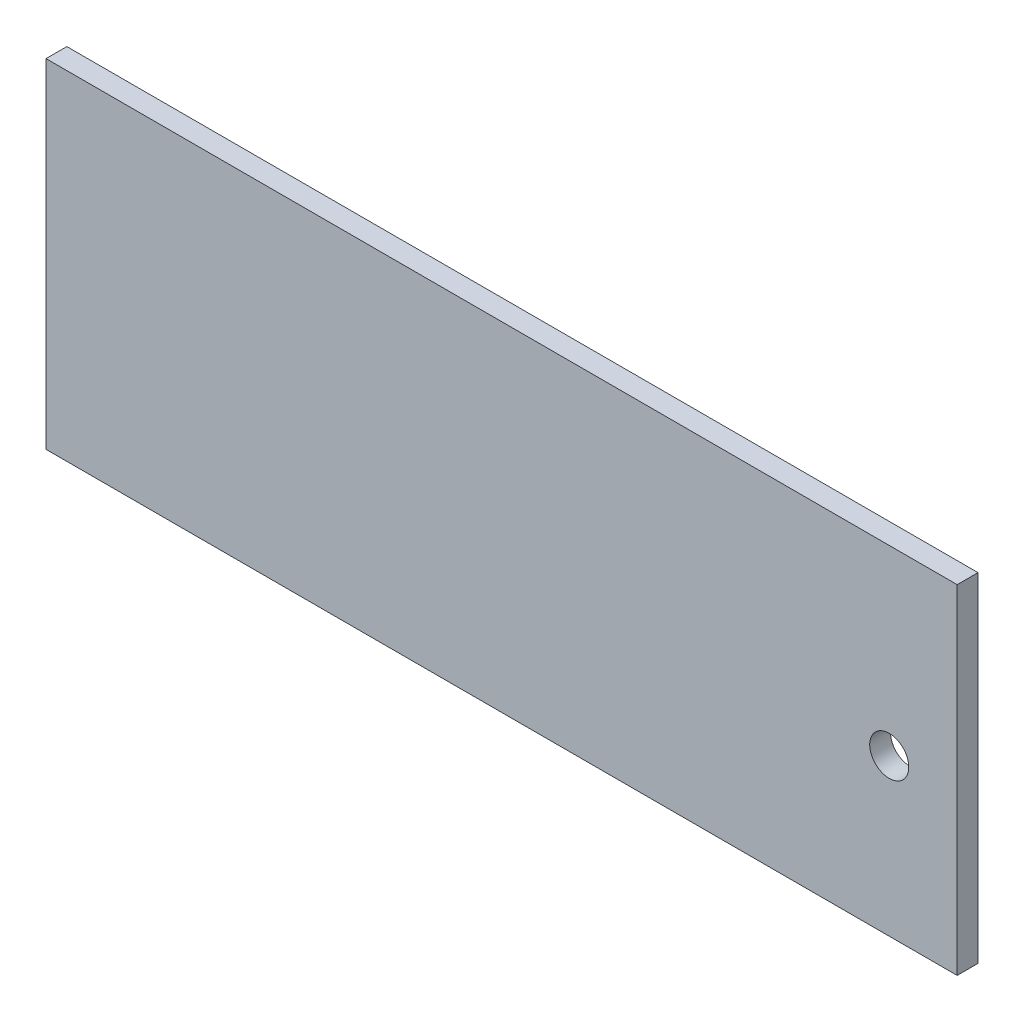
ISO-10303-21;
HEADER;
FILE_DESCRIPTION(('STEP AP214'),'2;1');
FILE_NAME('part.step','',(''),(''),'','','');
FILE_SCHEMA(('AUTOMOTIVE_DESIGN { 1 0 10303 214 1 1 1 1 }'));
ENDSEC;
DATA;
#1=APPLICATION_CONTEXT('core data for automotive mechanical design processes');
#2=APPLICATION_PROTOCOL_DEFINITION('international standard','automotive_design',2000,#1);
#3=PRODUCT_CONTEXT('',#1,'mechanical');
#4=PRODUCT('Part','Part','',(#3));
#5=PRODUCT_RELATED_PRODUCT_CATEGORY('part','',(#4));
#6=PRODUCT_DEFINITION_FORMATION('','',#4);
#7=PRODUCT_DEFINITION_CONTEXT('part definition',#1,'design');
#8=PRODUCT_DEFINITION('design','',#6,#7);
#9=PRODUCT_DEFINITION_SHAPE('','',#8);
#10=(LENGTH_UNIT() NAMED_UNIT(*) SI_UNIT(.MILLI.,.METRE.));
#11=(NAMED_UNIT(*) PLANE_ANGLE_UNIT() SI_UNIT($,.RADIAN.));
#12=(NAMED_UNIT(*) SI_UNIT($,.STERADIAN.) SOLID_ANGLE_UNIT());
#13=UNCERTAINTY_MEASURE_WITH_UNIT(LENGTH_MEASURE(1.E-05),#10,'distance_accuracy_value','');
#14=(GEOMETRIC_REPRESENTATION_CONTEXT(3) GLOBAL_UNCERTAINTY_ASSIGNED_CONTEXT((#13)) GLOBAL_UNIT_ASSIGNED_CONTEXT((#10,
#11,#12)) REPRESENTATION_CONTEXT('',''));
#15=CARTESIAN_POINT('',(0.,0.,0.));
#16=DIRECTION('',(0.,0.,1.));
#17=DIRECTION('',(1.,0.,0.));
#18=AXIS2_PLACEMENT_3D('',#15,#16,#17);
#19=CARTESIAN_POINT('',(0.,0.,0.8));
#20=DIRECTION('',(0.,0.,-1.));
#21=DIRECTION('',(-1.,0.,0.));
#22=AXIS2_PLACEMENT_3D('',#19,#20,#21);
#23=PLANE('',#22);
#24=DIRECTION('',(0.,-1.,0.));
#25=VECTOR('',#24,1.);
#26=CARTESIAN_POINT('',(0.,0.,0.8));
#27=LINE('',#26,#25);
#28=CARTESIAN_POINT('',(0.,13.,0.8));
#29=VERTEX_POINT('',#28);
#30=CARTESIAN_POINT('',(0.,0.,0.8));
#31=VERTEX_POINT('',#30);
#32=EDGE_CURVE('E96',#29,#31,#27,.T.);
#33=ORIENTED_EDGE('',*,*,#32,.T.);
#34=DIRECTION('',(1.,0.,0.));
#35=VECTOR('',#34,1.);
#36=CARTESIAN_POINT('',(0.,0.,0.8));
#37=LINE('',#36,#35);
#38=CARTESIAN_POINT('',(35.,0.,0.8));
#39=VERTEX_POINT('',#38);
#40=EDGE_CURVE('E91',#31,#39,#37,.T.);
#41=ORIENTED_EDGE('',*,*,#40,.T.);
#42=DIRECTION('',(0.,1.,0.));
#43=VECTOR('',#42,1.);
#44=CARTESIAN_POINT('',(35.,0.,0.8));
#45=LINE('',#44,#43);
#46=CARTESIAN_POINT('',(35.,13.,0.8));
#47=VERTEX_POINT('',#46);
#48=EDGE_CURVE('E94',#39,#47,#45,.T.);
#49=ORIENTED_EDGE('',*,*,#48,.T.);
#50=DIRECTION('',(-1.,0.,0.));
#51=VECTOR('',#50,1.);
#52=CARTESIAN_POINT('',(0.,13.,0.8));
#53=LINE('',#52,#51);
#54=EDGE_CURVE('E61',#47,#29,#53,.T.);
#55=ORIENTED_EDGE('',*,*,#54,.T.);
#56=EDGE_LOOP('',(#33,#41,#49,#55));
#57=FACE_BOUND('',#56,.T.);
#58=CARTESIAN_POINT('',(32.39,6.,0.8));
#59=DIRECTION('',(0.,0.,1.));
#60=DIRECTION('',(1.,0.,0.));
#61=AXIS2_PLACEMENT_3D('',#58,#59,#60);
#62=CIRCLE('',#61,0.749999999999999);
#63=CARTESIAN_POINT('',(33.14,6.,0.8));
#64=VERTEX_POINT('',#63);
#65=EDGE_CURVE('E116',#64,#64,#62,.T.);
#66=ORIENTED_EDGE('',*,*,#65,.F.);
#67=EDGE_LOOP('',(#66));
#68=FACE_BOUND('',#67,.T.);
#69=ADVANCED_FACE('F43',(#57,#68),#23,.F.);
#70=CARTESIAN_POINT('',(0.,0.,0.));
#71=DIRECTION('',(0.,0.,-1.));
#72=DIRECTION('',(-1.,0.,0.));
#73=AXIS2_PLACEMENT_3D('',#70,#71,#72);
#74=PLANE('',#73);
#75=DIRECTION('',(0.,-1.,0.));
#76=VECTOR('',#75,1.);
#77=CARTESIAN_POINT('',(0.,0.,0.));
#78=LINE('',#77,#76);
#79=CARTESIAN_POINT('',(0.,13.,0.));
#80=VERTEX_POINT('',#79);
#81=CARTESIAN_POINT('',(0.,0.,0.));
#82=VERTEX_POINT('',#81);
#83=EDGE_CURVE('E112',#80,#82,#78,.T.);
#84=ORIENTED_EDGE('',*,*,#83,.F.);
#85=DIRECTION('',(-1.,0.,0.));
#86=VECTOR('',#85,1.);
#87=CARTESIAN_POINT('',(0.,13.,0.));
#88=LINE('',#87,#86);
#89=CARTESIAN_POINT('',(35.,13.,0.));
#90=VERTEX_POINT('',#89);
#91=EDGE_CURVE('E84',#90,#80,#88,.T.);
#92=ORIENTED_EDGE('',*,*,#91,.F.);
#93=DIRECTION('',(0.,1.,0.));
#94=VECTOR('',#93,1.);
#95=CARTESIAN_POINT('',(35.,0.,0.));
#96=LINE('',#95,#94);
#97=CARTESIAN_POINT('',(35.,0.,0.));
#98=VERTEX_POINT('',#97);
#99=EDGE_CURVE('E78',#98,#90,#96,.T.);
#100=ORIENTED_EDGE('',*,*,#99,.F.);
#101=DIRECTION('',(1.,0.,0.));
#102=VECTOR('',#101,1.);
#103=CARTESIAN_POINT('',(0.,0.,0.));
#104=LINE('',#103,#102);
#105=EDGE_CURVE('E101',#82,#98,#104,.T.);
#106=ORIENTED_EDGE('',*,*,#105,.F.);
#107=EDGE_LOOP('',(#84,#92,#100,#106));
#108=FACE_BOUND('',#107,.T.);
#109=CARTESIAN_POINT('',(32.39,6.,0.));
#110=DIRECTION('',(0.,0.,1.));
#111=DIRECTION('',(1.,0.,0.));
#112=AXIS2_PLACEMENT_3D('',#109,#110,#111);
#113=CIRCLE('',#112,0.749999999999999);
#114=CARTESIAN_POINT('',(33.14,6.,0.));
#115=VERTEX_POINT('',#114);
#116=EDGE_CURVE('E134',#115,#115,#113,.T.);
#117=ORIENTED_EDGE('',*,*,#116,.T.);
#118=EDGE_LOOP('',(#117));
#119=FACE_BOUND('',#118,.T.);
#120=ADVANCED_FACE('F129',(#108,#119),#74,.T.);
#121=CARTESIAN_POINT('',(0.,0.,0.8));
#122=DIRECTION('',(1.,0.,0.));
#123=DIRECTION('',(0.,0.,-1.));
#124=AXIS2_PLACEMENT_3D('',#121,#122,#123);
#125=PLANE('',#124);
#126=ORIENTED_EDGE('',*,*,#83,.T.);
#127=DIRECTION('',(0.,0.,-1.));
#128=VECTOR('',#127,1.);
#129=CARTESIAN_POINT('',(0.,0.,0.8));
#130=LINE('',#129,#128);
#131=EDGE_CURVE('E11',#31,#82,#130,.T.);
#132=ORIENTED_EDGE('',*,*,#131,.F.);
#133=ORIENTED_EDGE('',*,*,#32,.F.);
#134=DIRECTION('',(0.,0.,-1.));
#135=VECTOR('',#134,1.);
#136=CARTESIAN_POINT('',(0.,13.,0.8));
#137=LINE('',#136,#135);
#138=EDGE_CURVE('E108',#29,#80,#137,.T.);
#139=ORIENTED_EDGE('',*,*,#138,.T.);
#140=EDGE_LOOP('',(#126,#132,#133,#139));
#141=FACE_BOUND('',#140,.T.);
#142=ADVANCED_FACE('F45',(#141),#125,.F.);
#143=CARTESIAN_POINT('',(0.,0.,0.8));
#144=DIRECTION('',(0.,1.,0.));
#145=DIRECTION('',(0.,0.,1.));
#146=AXIS2_PLACEMENT_3D('',#143,#144,#145);
#147=PLANE('',#146);
#148=ORIENTED_EDGE('',*,*,#105,.T.);
#149=DIRECTION('',(0.,0.,-1.));
#150=VECTOR('',#149,1.);
#151=CARTESIAN_POINT('',(35.,0.,0.8));
#152=LINE('',#151,#150);
#153=EDGE_CURVE('E53',#39,#98,#152,.T.);
#154=ORIENTED_EDGE('',*,*,#153,.F.);
#155=ORIENTED_EDGE('',*,*,#40,.F.);
#156=ORIENTED_EDGE('',*,*,#131,.T.);
#157=EDGE_LOOP('',(#148,#154,#155,#156));
#158=FACE_BOUND('',#157,.T.);
#159=ADVANCED_FACE('F100',(#158),#147,.F.);
#160=CARTESIAN_POINT('',(35.,0.,0.8));
#161=DIRECTION('',(-1.,0.,0.));
#162=DIRECTION('',(0.,0.,1.));
#163=AXIS2_PLACEMENT_3D('',#160,#161,#162);
#164=PLANE('',#163);
#165=ORIENTED_EDGE('',*,*,#99,.T.);
#166=DIRECTION('',(0.,0.,-1.));
#167=VECTOR('',#166,1.);
#168=CARTESIAN_POINT('',(35.,13.,0.8));
#169=LINE('',#168,#167);
#170=EDGE_CURVE('E103',#47,#90,#169,.T.);
#171=ORIENTED_EDGE('',*,*,#170,.F.);
#172=ORIENTED_EDGE('',*,*,#48,.F.);
#173=ORIENTED_EDGE('',*,*,#153,.T.);
#174=EDGE_LOOP('',(#165,#171,#172,#173));
#175=FACE_BOUND('',#174,.T.);
#176=ADVANCED_FACE('F104',(#175),#164,.F.);
#177=CARTESIAN_POINT('',(0.,13.,0.8));
#178=DIRECTION('',(0.,-1.,0.));
#179=DIRECTION('',(0.,0.,-1.));
#180=AXIS2_PLACEMENT_3D('',#177,#178,#179);
#181=PLANE('',#180);
#182=ORIENTED_EDGE('',*,*,#91,.T.);
#183=ORIENTED_EDGE('',*,*,#138,.F.);
#184=ORIENTED_EDGE('',*,*,#54,.F.);
#185=ORIENTED_EDGE('',*,*,#170,.T.);
#186=EDGE_LOOP('',(#182,#183,#184,#185));
#187=FACE_BOUND('',#186,.T.);
#188=ADVANCED_FACE('F126',(#187),#181,.F.);
#189=CARTESIAN_POINT('',(32.39,6.,0.8));
#190=DIRECTION('',(0.,0.,-1.));
#191=DIRECTION('',(-1.,0.,0.));
#192=AXIS2_PLACEMENT_3D('',#189,#190,#191);
#193=CYLINDRICAL_SURFACE('',#192,0.749999999999999);
#194=ORIENTED_EDGE('',*,*,#65,.T.);
#195=EDGE_LOOP('',(#194));
#196=FACE_BOUND('',#195,.T.);
#197=ORIENTED_EDGE('',*,*,#116,.F.);
#198=EDGE_LOOP('',(#197));
#199=FACE_BOUND('',#198,.T.);
#200=ADVANCED_FACE('F142',(#196,#199),#193,.F.);
#201=CLOSED_SHELL('',(#69,#120,#142,#159,#176,#188,#200));
#202=MANIFOLD_SOLID_BREP('B2',#201);
#203=ADVANCED_BREP_SHAPE_REPRESENTATION('',(#18,#202),#14);
#204=SHAPE_DEFINITION_REPRESENTATION(#9,#203);
ENDSEC;
END-ISO-10303-21;
